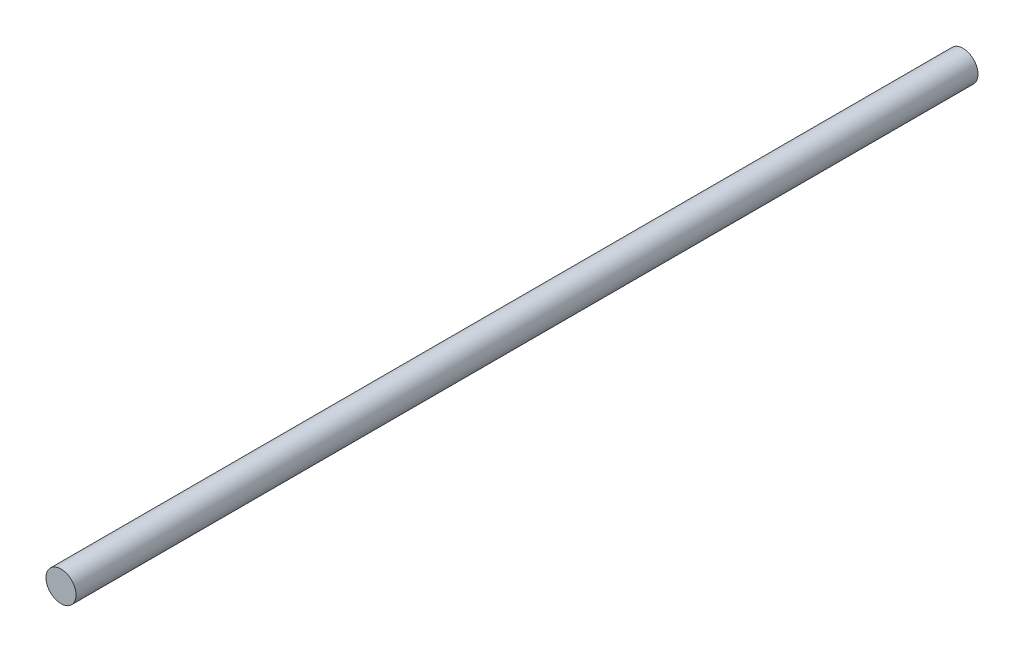
ISO-10303-21;
HEADER;
FILE_DESCRIPTION(('STEP AP214'),'2;1');
FILE_NAME('part.step','',(''),(''),'','','');
FILE_SCHEMA(('AUTOMOTIVE_DESIGN { 1 0 10303 214 1 1 1 1 }'));
ENDSEC;
DATA;
#1=APPLICATION_CONTEXT('core data for automotive mechanical design processes');
#2=APPLICATION_PROTOCOL_DEFINITION('international standard','automotive_design',2000,#1);
#3=PRODUCT_CONTEXT('',#1,'mechanical');
#4=PRODUCT('Part','Part','',(#3));
#5=PRODUCT_RELATED_PRODUCT_CATEGORY('part','',(#4));
#6=PRODUCT_DEFINITION_FORMATION('','',#4);
#7=PRODUCT_DEFINITION_CONTEXT('part definition',#1,'design');
#8=PRODUCT_DEFINITION('design','',#6,#7);
#9=PRODUCT_DEFINITION_SHAPE('','',#8);
#10=(LENGTH_UNIT() NAMED_UNIT(*) SI_UNIT(.MILLI.,.METRE.));
#11=(NAMED_UNIT(*) PLANE_ANGLE_UNIT() SI_UNIT($,.RADIAN.));
#12=(NAMED_UNIT(*) SI_UNIT($,.STERADIAN.) SOLID_ANGLE_UNIT());
#13=UNCERTAINTY_MEASURE_WITH_UNIT(LENGTH_MEASURE(1.E-05),#10,'distance_accuracy_value','');
#14=(GEOMETRIC_REPRESENTATION_CONTEXT(3) GLOBAL_UNCERTAINTY_ASSIGNED_CONTEXT((#13)) GLOBAL_UNIT_ASSIGNED_CONTEXT((#10,
#11,#12)) REPRESENTATION_CONTEXT('',''));
#15=CARTESIAN_POINT('',(0.,0.,0.));
#16=DIRECTION('',(0.,0.,1.));
#17=DIRECTION('',(1.,0.,0.));
#18=AXIS2_PLACEMENT_3D('',#15,#16,#17);
#19=CARTESIAN_POINT('',(0.,0.,600.));
#20=DIRECTION('',(0.,0.,-1.));
#21=DIRECTION('',(-1.,0.,0.));
#22=AXIS2_PLACEMENT_3D('',#19,#20,#21);
#23=CYLINDRICAL_SURFACE('',#22,10.);
#24=CARTESIAN_POINT('',(0.,0.,600.));
#25=DIRECTION('',(0.,0.,1.));
#26=DIRECTION('',(1.,0.,0.));
#27=AXIS2_PLACEMENT_3D('',#24,#25,#26);
#28=CIRCLE('',#27,10.);
#29=CARTESIAN_POINT('',(10.,0.,600.));
#30=VERTEX_POINT('',#29);
#31=EDGE_CURVE('E10',#30,#30,#28,.T.);
#32=ORIENTED_EDGE('',*,*,#31,.F.);
#33=EDGE_LOOP('',(#32));
#34=FACE_BOUND('',#33,.T.);
#35=CARTESIAN_POINT('',(0.,0.,0.));
#36=DIRECTION('',(0.,0.,1.));
#37=DIRECTION('',(1.,0.,0.));
#38=AXIS2_PLACEMENT_3D('',#35,#36,#37);
#39=CIRCLE('',#38,10.);
#40=CARTESIAN_POINT('',(10.,0.,0.));
#41=VERTEX_POINT('',#40);
#42=EDGE_CURVE('E39',#41,#41,#39,.T.);
#43=ORIENTED_EDGE('',*,*,#42,.T.);
#44=EDGE_LOOP('',(#43));
#45=FACE_BOUND('',#44,.T.);
#46=ADVANCED_FACE('F36',(#34,#45),#23,.T.);
#47=CARTESIAN_POINT('',(0.,0.,600.));
#48=DIRECTION('',(0.,0.,1.));
#49=DIRECTION('',(1.,0.,0.));
#50=AXIS2_PLACEMENT_3D('',#47,#48,#49);
#51=PLANE('',#50);
#52=ORIENTED_EDGE('',*,*,#31,.T.);
#53=EDGE_LOOP('',(#52));
#54=FACE_BOUND('',#53,.T.);
#55=ADVANCED_FACE('F51',(#54),#51,.T.);
#56=CARTESIAN_POINT('',(0.,0.,0.));
#57=DIRECTION('',(0.,0.,1.));
#58=DIRECTION('',(1.,0.,0.));
#59=AXIS2_PLACEMENT_3D('',#56,#57,#58);
#60=PLANE('',#59);
#61=ORIENTED_EDGE('',*,*,#42,.F.);
#62=EDGE_LOOP('',(#61));
#63=FACE_BOUND('',#62,.T.);
#64=ADVANCED_FACE('F49',(#63),#60,.F.);
#65=CLOSED_SHELL('',(#46,#55,#64));
#66=MANIFOLD_SOLID_BREP('B2',#65);
#67=ADVANCED_BREP_SHAPE_REPRESENTATION('',(#18,#66),#14);
#68=SHAPE_DEFINITION_REPRESENTATION(#9,#67);
ENDSEC;
END-ISO-10303-21;
